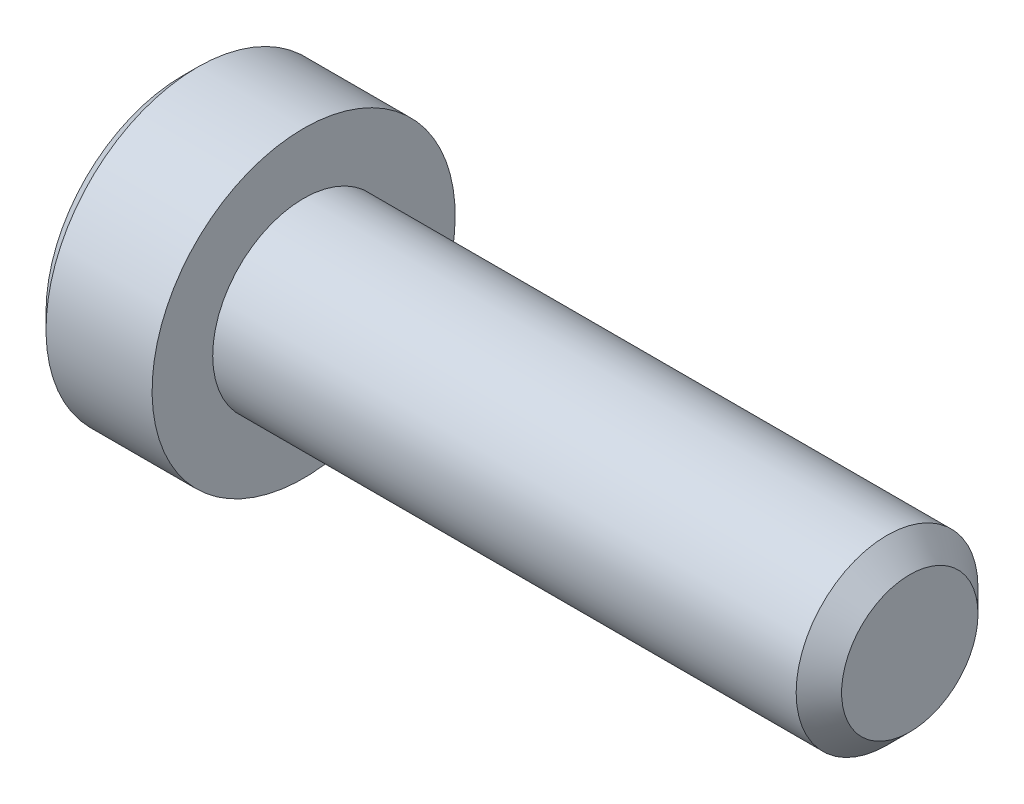
ISO-10303-21;
HEADER;
FILE_DESCRIPTION(('STEP AP214'),'2;1');
FILE_NAME('part.step','',(''),(''),'','','');
FILE_SCHEMA(('AUTOMOTIVE_DESIGN { 1 0 10303 214 1 1 1 1 }'));
ENDSEC;
DATA;
#1=APPLICATION_CONTEXT('core data for automotive mechanical design processes');
#2=APPLICATION_PROTOCOL_DEFINITION('international standard','automotive_design',2000,#1);
#3=PRODUCT_CONTEXT('',#1,'mechanical');
#4=PRODUCT('Part','Part','',(#3));
#5=PRODUCT_RELATED_PRODUCT_CATEGORY('part','',(#4));
#6=PRODUCT_DEFINITION_FORMATION('','',#4);
#7=PRODUCT_DEFINITION_CONTEXT('part definition',#1,'design');
#8=PRODUCT_DEFINITION('design','',#6,#7);
#9=PRODUCT_DEFINITION_SHAPE('','',#8);
#10=(LENGTH_UNIT() NAMED_UNIT(*) SI_UNIT(.MILLI.,.METRE.));
#11=(NAMED_UNIT(*) PLANE_ANGLE_UNIT() SI_UNIT($,.RADIAN.));
#12=(NAMED_UNIT(*) SI_UNIT($,.STERADIAN.) SOLID_ANGLE_UNIT());
#13=UNCERTAINTY_MEASURE_WITH_UNIT(LENGTH_MEASURE(1.E-05),#10,'distance_accuracy_value','');
#14=(GEOMETRIC_REPRESENTATION_CONTEXT(3) GLOBAL_UNCERTAINTY_ASSIGNED_CONTEXT((#13)) GLOBAL_UNIT_ASSIGNED_CONTEXT((#10,
#11,#12)) REPRESENTATION_CONTEXT('',''));
#15=CARTESIAN_POINT('',(0.,0.,0.));
#16=DIRECTION('',(0.,0.,1.));
#17=DIRECTION('',(1.,0.,0.));
#18=AXIS2_PLACEMENT_3D('',#15,#16,#17);
#19=CARTESIAN_POINT('',(-14.,4.5,0.));
#20=DIRECTION('',(-1.,0.,0.));
#21=DIRECTION('',(0.,-1.,0.));
#22=AXIS2_PLACEMENT_3D('',#19,#20,#21);
#23=PLANE('',#22);
#24=CARTESIAN_POINT('',(-14.,0.,0.));
#25=DIRECTION('',(-1.,0.,0.));
#26=DIRECTION('',(0.,-1.,0.));
#27=AXIS2_PLACEMENT_3D('',#24,#25,#26);
#28=CIRCLE('',#27,2.30940107675845);
#29=CARTESIAN_POINT('',(-14.,-2.30940107675842,-1.47451495458029E-13));
#30=VERTEX_POINT('',#29);
#31=CARTESIAN_POINT('',(-14.,-1.15470053837932,1.99999999999988));
#32=VERTEX_POINT('',#31);
#33=EDGE_CURVE('E142',#30,#32,#28,.T.);
#34=ORIENTED_EDGE('',*,*,#33,.F.);
#35=CARTESIAN_POINT('',(-14.,-1.15470053837925,-2.));
#36=VERTEX_POINT('',#35);
#37=EDGE_CURVE('E139',#36,#30,#28,.T.);
#38=ORIENTED_EDGE('',*,*,#37,.F.);
#39=CARTESIAN_POINT('',(-14.,1.15470053837917,-2.));
#40=VERTEX_POINT('',#39);
#41=EDGE_CURVE('E107',#40,#36,#28,.T.);
#42=ORIENTED_EDGE('',*,*,#41,.F.);
#43=CARTESIAN_POINT('',(-14.,2.30940107675848,0.));
#44=VERTEX_POINT('',#43);
#45=EDGE_CURVE('E99',#44,#40,#28,.T.);
#46=ORIENTED_EDGE('',*,*,#45,.F.);
#47=CARTESIAN_POINT('',(-14.,1.15470053837917,2.));
#48=VERTEX_POINT('',#47);
#49=EDGE_CURVE('E60',#48,#44,#28,.T.);
#50=ORIENTED_EDGE('',*,*,#49,.F.);
#51=EDGE_CURVE('E67',#32,#48,#28,.T.);
#52=ORIENTED_EDGE('',*,*,#51,.F.);
#53=EDGE_LOOP('',(#34,#38,#42,#46,#50,#52));
#54=FACE_BOUND('',#53,.T.);
#55=CARTESIAN_POINT('',(-14.,0.,0.));
#56=DIRECTION('',(1.,0.,0.));
#57=DIRECTION('',(0.,1.,0.));
#58=AXIS2_PLACEMENT_3D('',#55,#56,#57);
#59=CIRCLE('',#58,4.5);
#60=CARTESIAN_POINT('',(-14.,4.5,0.));
#61=VERTEX_POINT('',#60);
#62=EDGE_CURVE('E237',#61,#61,#59,.T.);
#63=ORIENTED_EDGE('',*,*,#62,.F.);
#64=EDGE_LOOP('',(#63));
#65=FACE_BOUND('',#64,.T.);
#66=ADVANCED_FACE('F39',(#54,#65),#23,.T.);
#67=CARTESIAN_POINT('',(-10.,0.,0.));
#68=DIRECTION('',(1.,0.,0.));
#69=DIRECTION('',(0.,0.,-1.));
#70=AXIS2_PLACEMENT_3D('',#67,#68,#69);
#71=CYLINDRICAL_SURFACE('',#70,3.);
#72=CARTESIAN_POINT('',(9.25,0.,0.));
#73=DIRECTION('',(1.,0.,0.));
#74=DIRECTION('',(0.,0.,-1.));
#75=AXIS2_PLACEMENT_3D('',#72,#73,#74);
#76=CIRCLE('',#75,3.);
#77=CARTESIAN_POINT('',(9.25,0.,-3.));
#78=VERTEX_POINT('',#77);
#79=EDGE_CURVE('E54',#78,#78,#76,.F.);
#80=ORIENTED_EDGE('',*,*,#79,.T.);
#81=EDGE_LOOP('',(#80));
#82=FACE_BOUND('',#81,.T.);
#83=CARTESIAN_POINT('',(-10.,0.,0.));
#84=DIRECTION('',(1.,0.,0.));
#85=DIRECTION('',(0.,1.,0.));
#86=AXIS2_PLACEMENT_3D('',#83,#84,#85);
#87=CIRCLE('',#86,3.);
#88=CARTESIAN_POINT('',(-10.,2.99999999999999,0.));
#89=VERTEX_POINT('',#88);
#90=EDGE_CURVE('E227',#89,#89,#87,.F.);
#91=ORIENTED_EDGE('',*,*,#90,.F.);
#92=EDGE_LOOP('',(#91));
#93=FACE_BOUND('',#92,.T.);
#94=ADVANCED_FACE('F207',(#82,#93),#71,.T.);
#95=CARTESIAN_POINT('',(10.,0.,0.));
#96=DIRECTION('',(1.,0.,0.));
#97=DIRECTION('',(0.,0.,-1.));
#98=AXIS2_PLACEMENT_3D('',#95,#96,#97);
#99=PLANE('',#98);
#100=CARTESIAN_POINT('',(10.,0.,0.));
#101=DIRECTION('',(1.,0.,0.));
#102=DIRECTION('',(0.,0.,-1.));
#103=AXIS2_PLACEMENT_3D('',#100,#101,#102);
#104=CIRCLE('',#103,2.25);
#105=CARTESIAN_POINT('',(10.,0.,-2.25));
#106=VERTEX_POINT('',#105);
#107=EDGE_CURVE('E229',#106,#106,#104,.T.);
#108=ORIENTED_EDGE('',*,*,#107,.T.);
#109=EDGE_LOOP('',(#108));
#110=FACE_BOUND('',#109,.T.);
#111=ADVANCED_FACE('F215',(#110),#99,.T.);
#112=CARTESIAN_POINT('',(10.,0.,0.));
#113=DIRECTION('',(-1.,0.,0.));
#114=DIRECTION('',(0.,0.,1.));
#115=AXIS2_PLACEMENT_3D('',#112,#113,#114);
#116=CONICAL_SURFACE('',#115,2.25,0.785398163397448);
#117=ORIENTED_EDGE('',*,*,#79,.F.);
#118=EDGE_LOOP('',(#117));
#119=FACE_BOUND('',#118,.T.);
#120=ORIENTED_EDGE('',*,*,#107,.F.);
#121=EDGE_LOOP('',(#120));
#122=FACE_BOUND('',#121,.T.);
#123=ADVANCED_FACE('F41',(#119,#122),#116,.T.);
#124=CARTESIAN_POINT('',(-10.,0.,0.));
#125=DIRECTION('',(1.,0.,0.));
#126=DIRECTION('',(0.,1.,0.));
#127=AXIS2_PLACEMENT_3D('',#124,#125,#126);
#128=CYLINDRICAL_SURFACE('',#127,5.);
#129=CARTESIAN_POINT('',(-13.5,0.,0.));
#130=DIRECTION('',(1.,0.,0.));
#131=DIRECTION('',(0.,1.,0.));
#132=AXIS2_PLACEMENT_3D('',#129,#130,#131);
#133=CIRCLE('',#132,5.);
#134=CARTESIAN_POINT('',(-13.5,4.99999999999999,0.));
#135=VERTEX_POINT('',#134);
#136=EDGE_CURVE('E230',#135,#135,#133,.T.);
#137=ORIENTED_EDGE('',*,*,#136,.T.);
#138=EDGE_LOOP('',(#137));
#139=FACE_BOUND('',#138,.T.);
#140=CARTESIAN_POINT('',(-10.,0.,0.));
#141=DIRECTION('',(1.,0.,0.));
#142=DIRECTION('',(0.,1.,0.));
#143=AXIS2_PLACEMENT_3D('',#140,#141,#142);
#144=CIRCLE('',#143,5.);
#145=CARTESIAN_POINT('',(-10.,5.,0.));
#146=VERTEX_POINT('',#145);
#147=EDGE_CURVE('E244',#146,#146,#144,.T.);
#148=ORIENTED_EDGE('',*,*,#147,.F.);
#149=EDGE_LOOP('',(#148));
#150=FACE_BOUND('',#149,.T.);
#151=ADVANCED_FACE('F210',(#139,#150),#128,.T.);
#152=CARTESIAN_POINT('',(-13.5,0.,0.));
#153=DIRECTION('',(1.,0.,0.));
#154=DIRECTION('',(0.,1.,0.));
#155=AXIS2_PLACEMENT_3D('',#152,#153,#154);
#156=CONICAL_SURFACE('',#155,5.,0.785398163397447);
#157=ORIENTED_EDGE('',*,*,#62,.T.);
#158=EDGE_LOOP('',(#157));
#159=FACE_BOUND('',#158,.T.);
#160=ORIENTED_EDGE('',*,*,#136,.F.);
#161=EDGE_LOOP('',(#160));
#162=FACE_BOUND('',#161,.T.);
#163=ADVANCED_FACE('F203',(#159,#162),#156,.T.);
#164=CARTESIAN_POINT('',(-10.,5.,0.));
#165=DIRECTION('',(1.,0.,0.));
#166=DIRECTION('',(0.,1.,0.));
#167=AXIS2_PLACEMENT_3D('',#164,#165,#166);
#168=PLANE('',#167);
#169=ORIENTED_EDGE('',*,*,#90,.T.);
#170=EDGE_LOOP('',(#169));
#171=FACE_BOUND('',#170,.T.);
#172=ORIENTED_EDGE('',*,*,#147,.T.);
#173=EDGE_LOOP('',(#172));
#174=FACE_BOUND('',#173,.T.);
#175=ADVANCED_FACE('F166',(#171,#174),#168,.T.);
#176=CARTESIAN_POINT('',(-14.,0.,0.));
#177=DIRECTION('',(-1.,0.,0.));
#178=DIRECTION('',(0.,-1.,0.));
#179=AXIS2_PLACEMENT_3D('',#176,#177,#178);
#180=CONICAL_SURFACE('',#179,2.30940107675845,0.78539816339745);
#181=CARTESIAN_POINT('',(-14.7407713552808,-2.30294417326428,-2.));
#182=CARTESIAN_POINT('',(-14.6984432738693,-2.24687002696277,-2.));
#183=CARTESIAN_POINT('',(-14.6565251570979,-2.19048190568581,-2.));
#184=CARTESIAN_POINT('',(-14.5736904180752,-2.0769539052615,-2.));
#185=CARTESIAN_POINT('',(-14.5327740498726,-2.01981384095227,-2.));
#186=CARTESIAN_POINT('',(-14.4518334522037,-1.90424016831612,-2.));
#187=CARTESIAN_POINT('',(-14.4118185917352,-1.84579996769761,-2.));
#188=CARTESIAN_POINT('',(-14.3332889938203,-1.72792745485623,-2.));
#189=CARTESIAN_POINT('',(-14.2947741503896,-1.66849521315184,-2.));
#190=CARTESIAN_POINT('',(-14.1776406517203,-1.48162995729571,-2.));
#191=CARTESIAN_POINT('',(-14.1021459018253,-1.35220318180734,-2.));
#192=CARTESIAN_POINT('',(-13.9640493510524,-1.08689521605217,-2.));
#193=CARTESIAN_POINT('',(-13.9014040859441,-0.9510377640356,-2.));
#194=CARTESIAN_POINT('',(-13.8247635439028,-0.747111912337621,-2.));
#195=CARTESIAN_POINT('',(-13.8027671799473,-0.682064034234127,-2.));
#196=CARTESIAN_POINT('',(-13.7639966876877,-0.550398103397343,-2.));
#197=CARTESIAN_POINT('',(-13.7472229191476,-0.483779942833367,-2.));
#198=CARTESIAN_POINT('',(-13.7200482579068,-0.350484328974875,-2.));
#199=CARTESIAN_POINT('',(-13.709538176761,-0.28382948950003,-2.));
#200=CARTESIAN_POINT('',(-13.6950960855565,-0.1498069872904,-2.));
#201=CARTESIAN_POINT('',(-13.69116294474,-0.0824394490928999,-2.));
#202=CARTESIAN_POINT('',(-13.6901664769297,0.0499055621214035,-2.));
#203=CARTESIAN_POINT('',(-13.6928596448403,0.114881284963513,-2.));
#204=CARTESIAN_POINT('',(-13.7044300703996,0.244275921290612,-2.));
#205=CARTESIAN_POINT('',(-13.7133079288032,0.30869478006869,-2.));
#206=CARTESIAN_POINT('',(-13.7369136592515,0.437599788400963,-2.));
#207=CARTESIAN_POINT('',(-13.7517410833942,0.502067428429108,-2.));
#208=CARTESIAN_POINT('',(-13.7864578835601,0.629594322371884,-2.));
#209=CARTESIAN_POINT('',(-13.8063468360306,0.692653693651538,-2.));
#210=CARTESIAN_POINT('',(-13.8764469791435,0.891187888928493,-2.));
#211=CARTESIAN_POINT('',(-13.9346418001747,1.02383545674829,-2.));
#212=CARTESIAN_POINT('',(-14.0640305752409,1.2829093210938,-2.));
#213=CARTESIAN_POINT('',(-14.1352712311583,1.40931112542935,-2.));
#214=CARTESIAN_POINT('',(-14.2464419915628,1.59200441388857,-2.));
#215=CARTESIAN_POINT('',(-14.2831821900084,1.65027548974484,-2.));
#216=CARTESIAN_POINT('',(-14.3582145138206,1.76581760334356,-2.));
#217=CARTESIAN_POINT('',(-14.3965067567377,1.8230885648664,-2.));
#218=CARTESIAN_POINT('',(-14.4740422636669,1.93629654702502,-2.));
#219=CARTESIAN_POINT('',(-14.5132752757023,1.99224062439417,-2.));
#220=CARTESIAN_POINT('',(-14.5927788302714,2.10336423965707,-2.));
#221=CARTESIAN_POINT('',(-14.6330490845185,2.15854398356746,-2.));
#222=CARTESIAN_POINT('',(-14.673744237647,2.21340370625409,-2.));
#223=B_SPLINE_CURVE_WITH_KNOTS('',3,(#181,#182,#183,#184,#185,#186,#187,#188,#189,#190,#191,
#192,#193,#194,#195,#196,#197,#198,#199,#200,#201,#202,#203,#204,#205,#206,#207,#208,#209,#210,
#211,#212,#213,#214,#215,#216,#217,#218,#219,#220,#221,#222),.UNSPECIFIED.,.F.,.F.,(4,2,2,2,2,2,
2,2,2,2,2,2,2,2,2,2,2,2,2,2,4),(0.,0.210772732017011,0.421598374738841,0.634057554744624,
0.846501696032186,1.29562155480994,1.74319622856098,1.94902062142336,2.15485918958133,
2.35699582530217,2.55909770457496,2.75388435576876,2.94868993036095,3.14690093471671,
3.34509535806593,3.77838155838773,4.21325029906867,4.41989056664098,4.6265465143258,
4.83152377076249,5.03644465872345),.UNSPECIFIED.);
#224=EDGE_CURVE('E11',#36,#40,#223,.T.);
#225=ORIENTED_EDGE('',*,*,#224,.T.);
#226=ORIENTED_EDGE('',*,*,#41,.T.);
#227=EDGE_LOOP('',(#225,#226));
#228=FACE_BOUND('',#227,.T.);
#229=ADVANCED_FACE('F112',(#228),#180,.F.);
#230=CARTESIAN_POINT('',(-14.0001154787138,-2.30951654681234,0.000200000000000397));
#231=CARTESIAN_POINT('',(-13.9604530902257,-2.26982196410711,-0.0685530340307059));
#232=CARTESIAN_POINT('',(-13.9231199822843,-2.22946361676571,-0.138455742135513));
#233=CARTESIAN_POINT('',(-13.8547636851362,-2.1471683966763,-0.280995244550439));
#234=CARTESIAN_POINT('',(-13.8237785337373,-2.10522369580641,-0.353645597565362));
#235=CARTESIAN_POINT('',(-13.7707002165442,-2.02064418875706,-0.500141601053977));
#236=CARTESIAN_POINT('',(-13.7484736271767,-1.97803092714268,-0.573949935246301));
#237=CARTESIAN_POINT('',(-13.7142288166752,-1.89186619344272,-0.723191631835273));
#238=CARTESIAN_POINT('',(-13.7021850291442,-1.84831735425552,-0.798620433918162));
#239=CARTESIAN_POINT('',(-13.6913185119057,-1.77326466747239,-0.928615500671091));
#240=CARTESIAN_POINT('',(-13.6897097536101,-1.74185780396624,-0.983013783970121));
#241=CARTESIAN_POINT('',(-13.6924188775988,-1.67909540053411,-1.09172145551971));
#242=CARTESIAN_POINT('',(-13.6967388377581,-1.64773988246021,-1.14603080592135));
#243=CARTESIAN_POINT('',(-13.71105956741,-1.58532489948419,-1.25413672758935));
#244=CARTESIAN_POINT('',(-13.7210666927621,-1.55426580541468,-1.30793265655481));
#245=CARTESIAN_POINT('',(-13.7462124302497,-1.49268469862227,-1.41459426230559));
#246=CARTESIAN_POINT('',(-13.7613506490423,-1.46216264491916,-1.46746001007073));
#247=CARTESIAN_POINT('',(-13.8062945034293,-1.38397803138048,-1.60287973308986));
#248=CARTESIAN_POINT('',(-13.8394888394259,-1.33680037273297,-1.68459383484949));
#249=CARTESIAN_POINT('',(-13.8955258231715,-1.26742988897853,-1.80474703725781));
#250=CARTESIAN_POINT('',(-13.915214702947,-1.2445692346153,-1.84434285210918));
#251=CARTESIAN_POINT('',(-13.9563873183649,-1.19927142554652,-1.92280095888787));
#252=CARTESIAN_POINT('',(-13.9778699516513,-1.17683402097614,-1.96166368359374));
#253=CARTESIAN_POINT('',(-14.0001154787137,-1.15458506832541,-2.0002));
#254=B_SPLINE_CURVE_WITH_KNOTS('',3,(#230,#231,#232,#233,#234,#235,#236,#237,#238,#239,#240,
#241,#242,#243,#244,#245,#246,#247,#248,#249,#250,#251,#252,#253),.UNSPECIFIED.,.F.,.F.,(4,2,2,
2,2,2,2,2,2,2,2,4),(0.,0.266420613771067,0.534393751523395,0.798110374376925,1.06116288956938,
1.24939906803723,1.43770123566249,1.62621426093934,1.81471283831916,2.11415604834146,
2.26347170717791,2.4126962696977),.UNSPECIFIED.);
#255=EDGE_CURVE('E145',#30,#36,#254,.T.);
#256=ORIENTED_EDGE('',*,*,#255,.T.);
#257=ORIENTED_EDGE('',*,*,#37,.T.);
#258=EDGE_LOOP('',(#256,#257));
#259=FACE_BOUND('',#258,.T.);
#260=ADVANCED_FACE('F165',(#259),#180,.F.);
#261=CARTESIAN_POINT('',(-14.0001154787137,-1.15458506832541,2.0002));
#262=CARTESIAN_POINT('',(-13.9604530902257,-1.19427965103064,1.93144696596929));
#263=CARTESIAN_POINT('',(-13.9231199822842,-1.23463799837204,1.86154425786449));
#264=CARTESIAN_POINT('',(-13.8547636851362,-1.31693321846145,1.71900475544957));
#265=CARTESIAN_POINT('',(-13.8237785337373,-1.35887791933134,1.64635440243464));
#266=CARTESIAN_POINT('',(-13.7707002165442,-1.44345742638069,1.49985839894603));
#267=CARTESIAN_POINT('',(-13.7484736271767,-1.48607068799506,1.42605006475371));
#268=CARTESIAN_POINT('',(-13.7142288166752,-1.57223542169502,1.27680836816474));
#269=CARTESIAN_POINT('',(-13.7021850291442,-1.61578426088223,1.20137956608186));
#270=CARTESIAN_POINT('',(-13.6913185119057,-1.69083694766535,1.07138449932893));
#271=CARTESIAN_POINT('',(-13.6897097536101,-1.7222438111715,1.0169862160299));
#272=CARTESIAN_POINT('',(-13.6924188775988,-1.78500621460363,0.908278544480313));
#273=CARTESIAN_POINT('',(-13.6967388377581,-1.81636173267754,0.853969194078667));
#274=CARTESIAN_POINT('',(-13.71105956741,-1.87877671565355,0.745863272410667));
#275=CARTESIAN_POINT('',(-13.7210666927621,-1.90983580972306,0.692067343445212));
#276=CARTESIAN_POINT('',(-13.7462124302498,-1.97141691651547,0.58540573769443));
#277=CARTESIAN_POINT('',(-13.7613506490423,-2.00193897021859,0.532539989929291));
#278=CARTESIAN_POINT('',(-13.8062945034293,-2.08012358375727,0.397120266910158));
#279=CARTESIAN_POINT('',(-13.8394888394259,-2.12730124240478,0.315406165150523));
#280=CARTESIAN_POINT('',(-13.8955258231715,-2.19667172615922,0.195252962742198));
#281=CARTESIAN_POINT('',(-13.915214702947,-2.21953238052245,0.155657147890823));
#282=CARTESIAN_POINT('',(-13.956387318365,-2.26483018959124,0.0771990411121281));
#283=CARTESIAN_POINT('',(-13.9778699516513,-2.28726759416161,0.0383363164062602));
#284=CARTESIAN_POINT('',(-14.0001154787138,-2.30951654681234,-0.000199999999999328));
#285=B_SPLINE_CURVE_WITH_KNOTS('',3,(#261,#262,#263,#264,#265,#266,#267,#268,#269,#270,#271,
#272,#273,#274,#275,#276,#277,#278,#279,#280,#281,#282,#283,#284),.UNSPECIFIED.,.F.,.F.,(4,2,2,
2,2,2,2,2,2,2,2,4),(0.,0.266420613771061,0.534393751523382,0.798110374376904,1.06116288956935,
1.2493990680372,1.43770123566246,1.62621426093931,1.81471283831913,2.11415604834144,
2.2634717071779,2.4126962696977),.UNSPECIFIED.);
#286=EDGE_CURVE('E153',#32,#30,#285,.T.);
#287=ORIENTED_EDGE('',*,*,#286,.T.);
#288=ORIENTED_EDGE('',*,*,#33,.T.);
#289=EDGE_LOOP('',(#287,#288));
#290=FACE_BOUND('',#289,.T.);
#291=ADVANCED_FACE('F291',(#290),#180,.F.);
#292=CARTESIAN_POINT('',(-14.7407713550278,-2.30294417292921,2.));
#293=CARTESIAN_POINT('',(-14.698443273626,-2.2468700266371,2.));
#294=CARTESIAN_POINT('',(-14.6565251568644,-2.19048190536957,2.));
#295=CARTESIAN_POINT('',(-14.5736904178611,-2.07695390496422,2.));
#296=CARTESIAN_POINT('',(-14.5327740496681,-2.01981384066452,2.));
#297=CARTESIAN_POINT('',(-14.4518334520186,-1.90424016804773,2.));
#298=CARTESIAN_POINT('',(-14.4118185915599,-1.84579996743907,2.));
#299=CARTESIAN_POINT('',(-14.3332889936644,-1.72792745461758,2.));
#300=CARTESIAN_POINT('',(-14.2947741502432,-1.66849521292321,2.));
#301=CARTESIAN_POINT('',(-14.1776406516044,-1.48162995710017,2.));
#302=CARTESIAN_POINT('',(-14.1021459017297,-1.35220318163534,2.));
#303=CARTESIAN_POINT('',(-13.9640493509944,-1.08689521592922,2.));
#304=CARTESIAN_POINT('',(-13.9014040859036,-0.951037763938166,2.));
#305=CARTESIAN_POINT('',(-13.8247635438752,-0.747111912259382,2.));
#306=CARTESIAN_POINT('',(-13.8027671799192,-0.682064034147849,2.));
#307=CARTESIAN_POINT('',(-13.7639966876602,-0.550398103294726,2.));
#308=CARTESIAN_POINT('',(-13.7472229191212,-0.483779942722449,2.));
#309=CARTESIAN_POINT('',(-13.7200482578845,-0.350484328847628,2.));
#310=CARTESIAN_POINT('',(-13.7095381767417,-0.283829489364759,2.));
#311=CARTESIAN_POINT('',(-13.695096085545,-0.14980698713935,2.));
#312=CARTESIAN_POINT('',(-13.6911629447332,-0.0824394489340956,2.));
#313=CARTESIAN_POINT('',(-13.6901664769338,0.0499055622945162,2.));
#314=CARTESIAN_POINT('',(-13.6928596448505,0.114881285143199,2.));
#315=CARTESIAN_POINT('',(-13.7044300704227,0.244275921482788,2.));
#316=CARTESIAN_POINT('',(-13.7133079288333,0.308694780266781,2.));
#317=CARTESIAN_POINT('',(-13.7369136592962,0.437599788610733,2.));
#318=CARTESIAN_POINT('',(-13.7517410834466,0.502067428644624,2.));
#319=CARTESIAN_POINT('',(-13.786457883628,0.629594322598335,2.));
#320=CARTESIAN_POINT('',(-13.8063468361063,0.69265369388318,2.));
#321=CARTESIAN_POINT('',(-13.8764469792563,0.891187889210574,2.));
#322=CARTESIAN_POINT('',(-13.9346418003216,1.02383545707309,2.));
#323=CARTESIAN_POINT('',(-14.0640305754596,1.28290932150077,2.));
#324=CARTESIAN_POINT('',(-14.1352712314149,1.40931112587573,2.));
#325=CARTESIAN_POINT('',(-14.2464419918748,1.59200441438966,2.));
#326=CARTESIAN_POINT('',(-14.2831821903374,1.65027549026194,2.));
#327=CARTESIAN_POINT('',(-14.3582145141838,1.76581760389245,2.));
#328=CARTESIAN_POINT('',(-14.3965067571181,1.82308856543107,2.));
#329=CARTESIAN_POINT('',(-14.4740422640813,1.93629654762087,2.));
#330=CARTESIAN_POINT('',(-14.5132752761336,1.99224062500542,2.));
#331=CARTESIAN_POINT('',(-14.5927788307366,2.10336424029903,2.));
#332=CARTESIAN_POINT('',(-14.6330490850006,2.15854398422471,2.));
#333=CARTESIAN_POINT('',(-14.673744238146,2.21340370692662,2.));
#334=B_SPLINE_CURVE_WITH_KNOTS('',3,(#292,#293,#294,#295,#296,#297,#298,#299,#300,#301,#302,
#303,#304,#305,#306,#307,#308,#309,#310,#311,#312,#313,#314,#315,#316,#317,#318,#319,#320,#321,
#322,#323,#324,#325,#326,#327,#328,#329,#330,#331,#332,#333),.UNSPECIFIED.,.F.,.F.,(4,2,2,2,2,2,
2,2,2,2,2,2,2,2,2,2,2,2,2,2,4),(0.,0.210772731976893,0.421598374658593,0.634057554623494,
0.846501695870177,1.29562155455625,1.74319622821646,1.94902062110208,2.15485918928327,
2.35699582502636,2.55909770432141,2.75388435553557,2.94868993014816,3.14690093452587,
3.34509535789703,3.77838155837655,4.21325029921626,4.41989056685648,4.62654651460922,
4.8315237711129,5.03644465914086),.UNSPECIFIED.);
#335=EDGE_CURVE('E173',#48,#32,#334,.F.);
#336=ORIENTED_EDGE('',*,*,#335,.T.);
#337=ORIENTED_EDGE('',*,*,#51,.T.);
#338=EDGE_LOOP('',(#336,#337));
#339=FACE_BOUND('',#338,.T.);
#340=ADVANCED_FACE('F309',(#339),#180,.F.);
#341=CARTESIAN_POINT('',(-14.0001154787137,2.30951654681234,-0.000200000000000116));
#342=CARTESIAN_POINT('',(-13.9604530902256,2.26982196410711,0.0685530340307047));
#343=CARTESIAN_POINT('',(-13.9231199822842,2.22946361676572,0.13845574213551));
#344=CARTESIAN_POINT('',(-13.8547636851362,2.14716839667631,0.280995244550433));
#345=CARTESIAN_POINT('',(-13.8237785337372,2.10522369580642,0.353645597565354));
#346=CARTESIAN_POINT('',(-13.7707002165442,2.02064418875707,0.500141601053965));
#347=CARTESIAN_POINT('',(-13.7484736271766,1.97803092714269,0.573949935246287));
#348=CARTESIAN_POINT('',(-13.7142288166751,1.89186619344273,0.723191631835256));
#349=CARTESIAN_POINT('',(-13.7021850291442,1.84831735425553,0.798620433918142));
#350=CARTESIAN_POINT('',(-13.6913185119056,1.7732646674724,0.928615500671068));
#351=CARTESIAN_POINT('',(-13.68970975361,1.74185780396625,0.983013783970097));
#352=CARTESIAN_POINT('',(-13.6924188775987,1.67909540053413,1.09172145551968));
#353=CARTESIAN_POINT('',(-13.696738837758,1.64773988246022,1.14603080592133));
#354=CARTESIAN_POINT('',(-13.7110595674099,1.58532489948421,1.25413672758932));
#355=CARTESIAN_POINT('',(-13.721066692762,1.5542658054147,1.30793265655478));
#356=CARTESIAN_POINT('',(-13.7462124302497,1.49268469862229,1.41459426230556));
#357=CARTESIAN_POINT('',(-13.7613506490423,1.46216264491918,1.4674600100707));
#358=CARTESIAN_POINT('',(-13.8062945034292,1.38397803138049,1.60287973308983));
#359=CARTESIAN_POINT('',(-13.8394888394258,1.33680037273298,1.68459383484947));
#360=CARTESIAN_POINT('',(-13.8955258231714,1.26742988897854,1.8047470372578));
#361=CARTESIAN_POINT('',(-13.915214702947,1.24456923461531,1.84434285210917));
#362=CARTESIAN_POINT('',(-13.9563873183649,1.19927142554652,1.92280095888787));
#363=CARTESIAN_POINT('',(-13.9778699516513,1.17683402097614,1.96166368359374));
#364=CARTESIAN_POINT('',(-14.0001154787137,1.15458506832541,2.0002));
#365=B_SPLINE_CURVE_WITH_KNOTS('',3,(#341,#342,#343,#344,#345,#346,#347,#348,#349,#350,#351,
#352,#353,#354,#355,#356,#357,#358,#359,#360,#361,#362,#363,#364),.UNSPECIFIED.,.F.,.F.,(4,2,2,
2,2,2,2,2,2,2,2,4),(0.,0.266420613771061,0.534393751523381,0.798110374376904,1.06116288956935,
1.2493990680372,1.43770123566246,1.6262142609393,1.81471283831911,2.11415604834144,
2.2634717071779,2.41269626969771),.UNSPECIFIED.);
#366=EDGE_CURVE('E128',#44,#48,#365,.T.);
#367=ORIENTED_EDGE('',*,*,#366,.T.);
#368=ORIENTED_EDGE('',*,*,#49,.T.);
#369=EDGE_LOOP('',(#367,#368));
#370=FACE_BOUND('',#369,.T.);
#371=ADVANCED_FACE('F281',(#370),#180,.F.);
#372=CARTESIAN_POINT('',(-14.0001154787137,1.15458506832541,-2.0002));
#373=CARTESIAN_POINT('',(-13.9604530902256,1.19427965103065,-1.93144696596929));
#374=CARTESIAN_POINT('',(-13.9231199822842,1.23463799837204,-1.86154425786449));
#375=CARTESIAN_POINT('',(-13.8547636851362,1.31693321846145,-1.71900475544956));
#376=CARTESIAN_POINT('',(-13.8237785337373,1.35887791933134,-1.64635440243464));
#377=CARTESIAN_POINT('',(-13.7707002165442,1.4434574263807,-1.49985839894602));
#378=CARTESIAN_POINT('',(-13.7484736271766,1.48607068799507,-1.4260500647537));
#379=CARTESIAN_POINT('',(-13.7142288166751,1.57223542169503,-1.27680836816473));
#380=CARTESIAN_POINT('',(-13.7021850291442,1.61578426088224,-1.20137956608184));
#381=CARTESIAN_POINT('',(-13.6913185119056,1.69083694766536,-1.07138449932891));
#382=CARTESIAN_POINT('',(-13.68970975361,1.72224381117151,-1.01698621602988));
#383=CARTESIAN_POINT('',(-13.6924188775987,1.78500621460364,-0.908278544480295));
#384=CARTESIAN_POINT('',(-13.696738837758,1.81636173267755,-0.85396919407865));
#385=CARTESIAN_POINT('',(-13.7110595674099,1.87877671565356,-0.745863272410652));
#386=CARTESIAN_POINT('',(-13.721066692762,1.90983580972307,-0.692067343445199));
#387=CARTESIAN_POINT('',(-13.7462124302497,1.97141691651548,-0.585405737694419));
#388=CARTESIAN_POINT('',(-13.7613506490423,2.00193897021859,-0.53253998992928));
#389=CARTESIAN_POINT('',(-13.8062945034292,2.08012358375727,-0.39712026691015));
#390=CARTESIAN_POINT('',(-13.8394888394258,2.12730124240478,-0.315406165150516));
#391=CARTESIAN_POINT('',(-13.8955258231714,2.19667172615922,-0.195252962742194));
#392=CARTESIAN_POINT('',(-13.915214702947,2.21953238052245,-0.15565714789082));
#393=CARTESIAN_POINT('',(-13.9563873183649,2.26483018959124,-0.0771990411121263));
#394=CARTESIAN_POINT('',(-13.9778699516513,2.28726759416161,-0.0383363164062589));
#395=CARTESIAN_POINT('',(-14.0001154787137,2.30951654681234,0.000200000000000093));
#396=B_SPLINE_CURVE_WITH_KNOTS('',3,(#372,#373,#374,#375,#376,#377,#378,#379,#380,#381,#382,
#383,#384,#385,#386,#387,#388,#389,#390,#391,#392,#393,#394,#395),.UNSPECIFIED.,.F.,.F.,(4,2,2,
2,2,2,2,2,2,2,2,4),(0.,0.266420613771068,0.534393751523397,0.798110374376927,1.06116288956938,
1.24939906803723,1.43770123566249,1.62621426093933,1.81471283831914,2.11415604834145,
2.26347170717791,2.41269626969771),.UNSPECIFIED.);
#397=EDGE_CURVE('E102',#40,#44,#396,.T.);
#398=ORIENTED_EDGE('',*,*,#397,.T.);
#399=ORIENTED_EDGE('',*,*,#45,.T.);
#400=EDGE_LOOP('',(#398,#399));
#401=FACE_BOUND('',#400,.T.);
#402=ADVANCED_FACE('F100',(#401),#180,.F.);
#403=CARTESIAN_POINT('',(-10.88,2.3094010767585,0.));
#404=DIRECTION('',(1.,0.,0.));
#405=DIRECTION('',(0.,0.,-1.));
#406=AXIS2_PLACEMENT_3D('',#403,#404,#405);
#407=PLANE('',#406);
#408=DIRECTION('',(0.,0.5,0.866025403784439));
#409=VECTOR('',#408,1.);
#410=CARTESIAN_POINT('',(-10.88,1.15470053837925,-2.));
#411=LINE('',#410,#409);
#412=CARTESIAN_POINT('',(-10.88,1.15470053837925,-2.));
#413=VERTEX_POINT('',#412);
#414=CARTESIAN_POINT('',(-10.88,2.3094010767585,0.));
#415=VERTEX_POINT('',#414);
#416=EDGE_CURVE('E127',#413,#415,#411,.T.);
#417=ORIENTED_EDGE('',*,*,#416,.F.);
#418=DIRECTION('',(0.,1.,0.));
#419=VECTOR('',#418,1.);
#420=CARTESIAN_POINT('',(-10.88,-1.15470053837925,-2.));
#421=LINE('',#420,#419);
#422=CARTESIAN_POINT('',(-10.88,-1.15470053837925,-2.));
#423=VERTEX_POINT('',#422);
#424=EDGE_CURVE('E132',#423,#413,#421,.T.);
#425=ORIENTED_EDGE('',*,*,#424,.F.);
#426=DIRECTION('',(0.,0.5,-0.866025403784439));
#427=VECTOR('',#426,1.);
#428=CARTESIAN_POINT('',(-10.88,-2.3094010767585,0.));
#429=LINE('',#428,#427);
#430=CARTESIAN_POINT('',(-10.88,-2.3094010767585,0.));
#431=VERTEX_POINT('',#430);
#432=EDGE_CURVE('E266',#431,#423,#429,.T.);
#433=ORIENTED_EDGE('',*,*,#432,.F.);
#434=DIRECTION('',(0.,-0.5,-0.866025403784439));
#435=VECTOR('',#434,1.);
#436=CARTESIAN_POINT('',(-10.88,-1.15470053837925,2.));
#437=LINE('',#436,#435);
#438=CARTESIAN_POINT('',(-10.88,-1.15470053837925,2.));
#439=VERTEX_POINT('',#438);
#440=EDGE_CURVE('E269',#439,#431,#437,.T.);
#441=ORIENTED_EDGE('',*,*,#440,.F.);
#442=DIRECTION('',(0.,-1.,0.));
#443=VECTOR('',#442,1.);
#444=CARTESIAN_POINT('',(-10.88,1.15470053837925,2.));
#445=LINE('',#444,#443);
#446=CARTESIAN_POINT('',(-10.88,1.15470053837925,2.));
#447=VERTEX_POINT('',#446);
#448=EDGE_CURVE('E272',#447,#439,#445,.T.);
#449=ORIENTED_EDGE('',*,*,#448,.F.);
#450=DIRECTION('',(0.,-0.5,0.866025403784439));
#451=VECTOR('',#450,1.);
#452=CARTESIAN_POINT('',(-10.88,2.3094010767585,0.));
#453=LINE('',#452,#451);
#454=EDGE_CURVE('E275',#415,#447,#453,.T.);
#455=ORIENTED_EDGE('',*,*,#454,.F.);
#456=EDGE_LOOP('',(#417,#425,#433,#441,#449,#455));
#457=FACE_BOUND('',#456,.T.);
#458=ADVANCED_FACE('F167',(#457),#407,.F.);
#459=CARTESIAN_POINT('',(-10.88,-1.15470053837925,-2.));
#460=DIRECTION('',(0.,0.,1.));
#461=DIRECTION('',(0.,-1.,0.));
#462=AXIS2_PLACEMENT_3D('',#459,#460,#461);
#463=PLANE('',#462);
#464=ORIENTED_EDGE('',*,*,#224,.F.);
#465=DIRECTION('',(-1.,0.,0.));
#466=VECTOR('',#465,1.);
#467=CARTESIAN_POINT('',(-10.88,-1.15470053837925,-2.));
#468=LINE('',#467,#466);
#469=EDGE_CURVE('E134',#423,#36,#468,.T.);
#470=ORIENTED_EDGE('',*,*,#469,.F.);
#471=ORIENTED_EDGE('',*,*,#424,.T.);
#472=DIRECTION('',(-1.,0.,0.));
#473=VECTOR('',#472,1.);
#474=CARTESIAN_POINT('',(-10.88,1.15470053837925,-2.));
#475=LINE('',#474,#473);
#476=EDGE_CURVE('E122',#413,#40,#475,.T.);
#477=ORIENTED_EDGE('',*,*,#476,.T.);
#478=EDGE_LOOP('',(#464,#470,#471,#477));
#479=FACE_BOUND('',#478,.T.);
#480=ADVANCED_FACE('F130',(#479),#463,.T.);
#481=CARTESIAN_POINT('',(-10.88,-2.3094010767585,0.));
#482=DIRECTION('',(0.,0.866025403784439,0.5));
#483=DIRECTION('',(0.,-0.5,0.866025403784439));
#484=AXIS2_PLACEMENT_3D('',#481,#482,#483);
#485=PLANE('',#484);
#486=ORIENTED_EDGE('',*,*,#255,.F.);
#487=DIRECTION('',(-1.,0.,0.));
#488=VECTOR('',#487,1.);
#489=CARTESIAN_POINT('',(-10.88,-2.3094010767585,0.));
#490=LINE('',#489,#488);
#491=EDGE_CURVE('E258',#431,#30,#490,.T.);
#492=ORIENTED_EDGE('',*,*,#491,.F.);
#493=ORIENTED_EDGE('',*,*,#432,.T.);
#494=ORIENTED_EDGE('',*,*,#469,.T.);
#495=EDGE_LOOP('',(#486,#492,#493,#494));
#496=FACE_BOUND('',#495,.T.);
#497=ADVANCED_FACE('F160',(#496),#485,.T.);
#498=CARTESIAN_POINT('',(-10.88,-1.15470053837925,2.));
#499=DIRECTION('',(0.,0.866025403784439,-0.5));
#500=DIRECTION('',(0.,0.5,0.866025403784439));
#501=AXIS2_PLACEMENT_3D('',#498,#499,#500);
#502=PLANE('',#501);
#503=ORIENTED_EDGE('',*,*,#286,.F.);
#504=DIRECTION('',(-1.,0.,0.));
#505=VECTOR('',#504,1.);
#506=CARTESIAN_POINT('',(-10.88,-1.15470053837925,2.));
#507=LINE('',#506,#505);
#508=EDGE_CURVE('E254',#439,#32,#507,.T.);
#509=ORIENTED_EDGE('',*,*,#508,.F.);
#510=ORIENTED_EDGE('',*,*,#440,.T.);
#511=ORIENTED_EDGE('',*,*,#491,.T.);
#512=EDGE_LOOP('',(#503,#509,#510,#511));
#513=FACE_BOUND('',#512,.T.);
#514=ADVANCED_FACE('F297',(#513),#502,.T.);
#515=CARTESIAN_POINT('',(-10.88,1.15470053837925,2.));
#516=DIRECTION('',(0.,0.,-1.));
#517=DIRECTION('',(-1.,0.,0.));
#518=AXIS2_PLACEMENT_3D('',#515,#516,#517);
#519=PLANE('',#518);
#520=ORIENTED_EDGE('',*,*,#335,.F.);
#521=DIRECTION('',(-1.,0.,0.));
#522=VECTOR('',#521,1.);
#523=CARTESIAN_POINT('',(-10.88,1.15470053837925,2.));
#524=LINE('',#523,#522);
#525=EDGE_CURVE('E250',#447,#48,#524,.T.);
#526=ORIENTED_EDGE('',*,*,#525,.F.);
#527=ORIENTED_EDGE('',*,*,#448,.T.);
#528=ORIENTED_EDGE('',*,*,#508,.T.);
#529=EDGE_LOOP('',(#520,#526,#527,#528));
#530=FACE_BOUND('',#529,.T.);
#531=ADVANCED_FACE('F195',(#530),#519,.T.);
#532=CARTESIAN_POINT('',(-10.88,2.3094010767585,0.));
#533=DIRECTION('',(0.,-0.866025403784439,-0.5));
#534=DIRECTION('',(0.,0.5,-0.866025403784439));
#535=AXIS2_PLACEMENT_3D('',#532,#533,#534);
#536=PLANE('',#535);
#537=ORIENTED_EDGE('',*,*,#366,.F.);
#538=DIRECTION('',(-1.,0.,0.));
#539=VECTOR('',#538,1.);
#540=CARTESIAN_POINT('',(-10.88,2.3094010767585,0.));
#541=LINE('',#540,#539);
#542=EDGE_CURVE('E125',#415,#44,#541,.T.);
#543=ORIENTED_EDGE('',*,*,#542,.F.);
#544=ORIENTED_EDGE('',*,*,#454,.T.);
#545=ORIENTED_EDGE('',*,*,#525,.T.);
#546=EDGE_LOOP('',(#537,#543,#544,#545));
#547=FACE_BOUND('',#546,.T.);
#548=ADVANCED_FACE('F192',(#547),#536,.T.);
#549=CARTESIAN_POINT('',(-10.88,1.15470053837925,-2.));
#550=DIRECTION('',(0.,-0.866025403784439,0.5));
#551=DIRECTION('',(0.,-0.5,-0.866025403784439));
#552=AXIS2_PLACEMENT_3D('',#549,#550,#551);
#553=PLANE('',#552);
#554=ORIENTED_EDGE('',*,*,#397,.F.);
#555=ORIENTED_EDGE('',*,*,#476,.F.);
#556=ORIENTED_EDGE('',*,*,#416,.T.);
#557=ORIENTED_EDGE('',*,*,#542,.T.);
#558=EDGE_LOOP('',(#554,#555,#556,#557));
#559=FACE_BOUND('',#558,.T.);
#560=ADVANCED_FACE('F120',(#559),#553,.T.);
#561=CLOSED_SHELL('',(#66,#94,#111,#123,#151,#163,#175,#229,#260,#291,#340,#371,#402,#458,#480,
#497,#514,#531,#548,#560));
#562=MANIFOLD_SOLID_BREP('B2',#561);
#563=ADVANCED_BREP_SHAPE_REPRESENTATION('',(#18,#562),#14);
#564=SHAPE_DEFINITION_REPRESENTATION(#9,#563);
ENDSEC;
END-ISO-10303-21;
